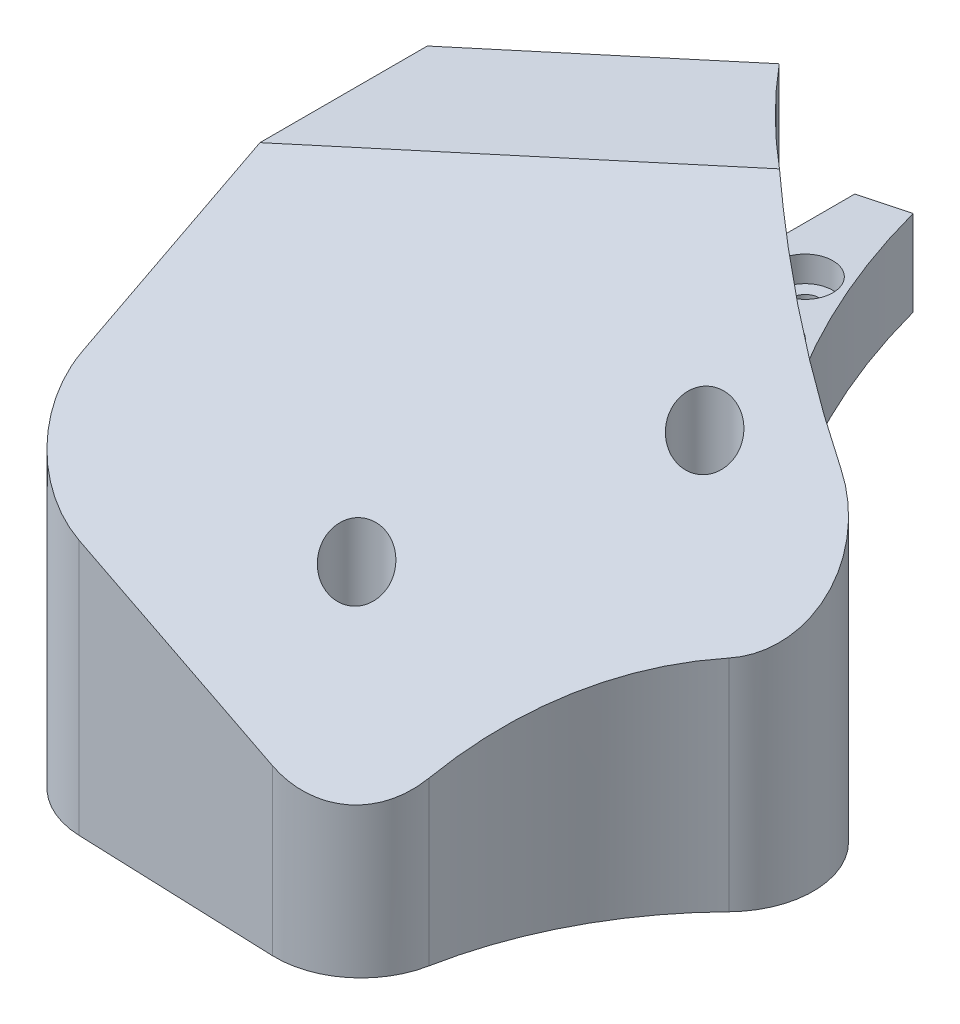
ISO-10303-21;
HEADER;
FILE_DESCRIPTION(('STEP AP214'),'2;1');
FILE_NAME('part.step','',(''),(''),'','','');
FILE_SCHEMA(('AUTOMOTIVE_DESIGN { 1 0 10303 214 1 1 1 1 }'));
ENDSEC;
DATA;
#1=APPLICATION_CONTEXT('core data for automotive mechanical design processes');
#2=APPLICATION_PROTOCOL_DEFINITION('international standard','automotive_design',2000,#1);
#3=PRODUCT_CONTEXT('',#1,'mechanical');
#4=PRODUCT('Part','Part','',(#3));
#5=PRODUCT_RELATED_PRODUCT_CATEGORY('part','',(#4));
#6=PRODUCT_DEFINITION_FORMATION('','',#4);
#7=PRODUCT_DEFINITION_CONTEXT('part definition',#1,'design');
#8=PRODUCT_DEFINITION('design','',#6,#7);
#9=PRODUCT_DEFINITION_SHAPE('','',#8);
#10=(LENGTH_UNIT() NAMED_UNIT(*) SI_UNIT(.MILLI.,.METRE.));
#11=(NAMED_UNIT(*) PLANE_ANGLE_UNIT() SI_UNIT($,.RADIAN.));
#12=(NAMED_UNIT(*) SI_UNIT($,.STERADIAN.) SOLID_ANGLE_UNIT());
#13=UNCERTAINTY_MEASURE_WITH_UNIT(LENGTH_MEASURE(1.E-05),#10,'distance_accuracy_value','');
#14=(GEOMETRIC_REPRESENTATION_CONTEXT(3) GLOBAL_UNCERTAINTY_ASSIGNED_CONTEXT((#13)) GLOBAL_UNIT_ASSIGNED_CONTEXT((#10,
#11,#12)) REPRESENTATION_CONTEXT('',''));
#15=CARTESIAN_POINT('',(0.,0.,0.));
#16=DIRECTION('',(0.,0.,1.));
#17=DIRECTION('',(1.,0.,0.));
#18=AXIS2_PLACEMENT_3D('',#15,#16,#17);
#19=CARTESIAN_POINT('',(690.079824827852,956.573514477968,1340.32447197574));
#20=DIRECTION('',(0.,-1.,0.));
#21=DIRECTION('',(0.,0.,-1.));
#22=AXIS2_PLACEMENT_3D('',#19,#20,#21);
#23=CYLINDRICAL_SURFACE('',#22,84.9999999999999);
#24=CARTESIAN_POINT('',(690.079824827852,1006.70276116639,1340.32447197574));
#25=DIRECTION('',(-0.359725820843491,-0.828739857716825,-0.428704539339128));
#26=DIRECTION('',(0.532703712193763,-0.559634030623136,0.634851562795184));
#27=AXIS2_PLACEMENT_3D('',#24,#25,#26);
#28=ELLIPSE('',#27,102.565357763985,84.9999999999999);
#29=CARTESIAN_POINT('',(654.936479666339,981.921153127971,1417.71920881785));
#30=VERTEX_POINT('',#29);
#31=CARTESIAN_POINT('',(635.629762562526,996.573514477968,1405.59460848013));
#32=VERTEX_POINT('',#31);
#33=EDGE_CURVE('E149',#30,#32,#28,.T.);
#34=ORIENTED_EDGE('',*,*,#33,.F.);
#35=DIRECTION('',(0.,-1.,0.));
#36=VECTOR('',#35,1.);
#37=CARTESIAN_POINT('',(654.936479666339,956.573514477968,1417.71920881785));
#38=LINE('',#37,#36);
#39=CARTESIAN_POINT('',(654.936479666339,946.573514477968,1417.71920881785));
#40=VERTEX_POINT('',#39);
#41=EDGE_CURVE('E11',#30,#40,#38,.T.);
#42=ORIENTED_EDGE('',*,*,#41,.T.);
#43=CARTESIAN_POINT('',(690.079824827852,946.573514477968,1340.32447197574));
#44=DIRECTION('',(0.,1.,0.));
#45=DIRECTION('',(0.,0.,1.));
#46=AXIS2_PLACEMENT_3D('',#43,#44,#45);
#47=CIRCLE('',#46,84.9999999999999);
#48=CARTESIAN_POINT('',(607.970423031093,946.573514477968,1362.30278257001));
#49=VERTEX_POINT('',#48);
#50=EDGE_CURVE('E183',#49,#40,#47,.T.);
#51=ORIENTED_EDGE('',*,*,#50,.F.);
#52=DIRECTION('',(0.,-1.,0.));
#53=VECTOR('',#52,1.);
#54=CARTESIAN_POINT('',(607.970423031093,956.573514477968,1362.30278257001));
#55=LINE('',#54,#53);
#56=CARTESIAN_POINT('',(607.970423031093,956.573514477968,1362.30278257001));
#57=VERTEX_POINT('',#56);
#58=EDGE_CURVE('E161',#57,#49,#55,.T.);
#59=ORIENTED_EDGE('',*,*,#58,.F.);
#60=CARTESIAN_POINT('',(690.079824827852,956.573514477968,1340.32447197574));
#61=DIRECTION('',(0.,1.,0.));
#62=DIRECTION('',(0.,0.,1.));
#63=AXIS2_PLACEMENT_3D('',#60,#61,#62);
#64=CIRCLE('',#63,84.9999999999999);
#65=CARTESIAN_POINT('',(624.966047162739,956.573514477968,1394.9614187991));
#66=VERTEX_POINT('',#65);
#67=EDGE_CURVE('E184',#57,#66,#64,.T.);
#68=ORIENTED_EDGE('',*,*,#67,.T.);
#69=DIRECTION('',(0.,-1.,0.));
#70=VECTOR('',#69,1.);
#71=CARTESIAN_POINT('',(624.966047162739,996.573514477968,1394.9614187991));
#72=LINE('',#71,#70);
#73=CARTESIAN_POINT('',(624.966047162739,996.573514477968,1394.9614187991));
#74=VERTEX_POINT('',#73);
#75=EDGE_CURVE('E172',#74,#66,#72,.T.);
#76=ORIENTED_EDGE('',*,*,#75,.F.);
#77=CARTESIAN_POINT('',(690.079824827852,996.573514477968,1340.32447197574));
#78=DIRECTION('',(0.,1.,0.));
#79=DIRECTION('',(0.,0.,1.));
#80=AXIS2_PLACEMENT_3D('',#77,#78,#79);
#81=CIRCLE('',#80,84.9999999999999);
#82=EDGE_CURVE('E168',#74,#32,#81,.T.);
#83=ORIENTED_EDGE('',*,*,#82,.T.);
#84=EDGE_LOOP('',(#34,#42,#51,#59,#68,#76,#83));
#85=FACE_BOUND('',#84,.T.);
#86=ADVANCED_FACE('F49',(#85),#23,.F.);
#87=CARTESIAN_POINT('',(380.916913119868,956.573514477968,1423.07843618761));
#88=DIRECTION('',(-0.2585683599326,0.,-0.965992962314822));
#89=DIRECTION('',(-0.965992962314822,0.,0.2585683599326));
#90=AXIS2_PLACEMENT_3D('',#87,#88,#89);
#91=PLANE('',#90);
#92=DIRECTION('',(0.965992962314822,0.,-0.2585683599326));
#93=VECTOR('',#92,1.);
#94=CARTESIAN_POINT('',(380.916913119868,946.573514477968,1423.07843618761));
#95=LINE('',#94,#93);
#96=CARTESIAN_POINT('',(602.579824827852,946.573514477968,1363.74568970375));
#97=VERTEX_POINT('',#96);
#98=EDGE_CURVE('E201',#97,#49,#95,.T.);
#99=ORIENTED_EDGE('',*,*,#98,.F.);
#100=DIRECTION('',(0.,-1.,0.));
#101=VECTOR('',#100,1.);
#102=CARTESIAN_POINT('',(602.579824827852,956.573514477968,1363.74568970375));
#103=LINE('',#102,#101);
#104=CARTESIAN_POINT('',(602.579824827852,956.573514477968,1363.74568970375));
#105=VERTEX_POINT('',#104);
#106=EDGE_CURVE('E197',#105,#97,#103,.T.);
#107=ORIENTED_EDGE('',*,*,#106,.F.);
#108=DIRECTION('',(0.965992962314822,0.,-0.2585683599326));
#109=VECTOR('',#108,1.);
#110=CARTESIAN_POINT('',(380.916913119868,956.573514477968,1423.07843618761));
#111=LINE('',#110,#109);
#112=EDGE_CURVE('E188',#105,#57,#111,.T.);
#113=ORIENTED_EDGE('',*,*,#112,.T.);
#114=ORIENTED_EDGE('',*,*,#58,.T.);
#115=EDGE_LOOP('',(#99,#107,#113,#114));
#116=FACE_BOUND('',#115,.T.);
#117=ADVANCED_FACE('F289',(#116),#91,.T.);
#118=CARTESIAN_POINT('',(602.579824827852,956.573514477968,0.));
#119=DIRECTION('',(1.,0.,0.));
#120=DIRECTION('',(0.,0.,-1.));
#121=AXIS2_PLACEMENT_3D('',#118,#119,#120);
#122=PLANE('',#121);
#123=DIRECTION('',(0.,0.,1.));
#124=VECTOR('',#123,1.);
#125=CARTESIAN_POINT('',(602.579824827852,946.573514477968,0.));
#126=LINE('',#125,#124);
#127=CARTESIAN_POINT('',(602.579824827852,946.573514477968,1454.11027046215));
#128=VERTEX_POINT('',#127);
#129=EDGE_CURVE('E205',#97,#128,#126,.T.);
#130=ORIENTED_EDGE('',*,*,#129,.T.);
#131=DIRECTION('',(0.,-1.,0.));
#132=VECTOR('',#131,1.);
#133=CARTESIAN_POINT('',(602.579824827852,956.573514477968,1454.11027046215));
#134=LINE('',#133,#132);
#135=CARTESIAN_POINT('',(602.579824827852,985.822289642653,1454.11027046215));
#136=VERTEX_POINT('',#135);
#137=EDGE_CURVE('E146',#128,#136,#134,.F.);
#138=ORIENTED_EDGE('',*,*,#137,.T.);
#139=DIRECTION('',(0.,0.459461806354499,-0.888197527862728));
#140=VECTOR('',#139,1.);
#141=CARTESIAN_POINT('',(602.579824827852,1573.05971327824,318.9063846811));
#142=LINE('',#141,#140);
#143=CARTESIAN_POINT('',(602.579824827855,996.573514477965,1433.32679904373));
#144=VERTEX_POINT('',#143);
#145=EDGE_CURVE('E137',#136,#144,#142,.T.);
#146=ORIENTED_EDGE('',*,*,#145,.T.);
#147=DIRECTION('',(0.,0.,-1.));
#148=VECTOR('',#147,1.);
#149=CARTESIAN_POINT('',(602.579824827852,996.573514477968,0.));
#150=LINE('',#149,#148);
#151=CARTESIAN_POINT('',(602.579824827852,996.573514477968,1413.74568970375));
#152=VERTEX_POINT('',#151);
#153=EDGE_CURVE('E143',#144,#152,#150,.T.);
#154=ORIENTED_EDGE('',*,*,#153,.T.);
#155=DIRECTION('',(0.,-1.,0.));
#156=VECTOR('',#155,1.);
#157=CARTESIAN_POINT('',(602.579824827852,996.573514477968,1413.74568970375));
#158=LINE('',#157,#156);
#159=CARTESIAN_POINT('',(602.579824827852,976.573514477968,1413.74568970375));
#160=VERTEX_POINT('',#159);
#161=EDGE_CURVE('E180',#152,#160,#158,.T.);
#162=ORIENTED_EDGE('',*,*,#161,.T.);
#163=CARTESIAN_POINT('',(602.579824827852,976.573514477968,1413.74568970375));
#164=CARTESIAN_POINT('',(602.579824827852,976.289515428693,1413.74571179691));
#165=CARTESIAN_POINT('',(602.579824827852,976.005522314769,1413.73779442892));
#166=CARTESIAN_POINT('',(602.579824827852,975.438577532554,1413.70624392088));
#167=CARTESIAN_POINT('',(602.579824827852,975.155625348713,1413.68262005492));
#168=CARTESIAN_POINT('',(602.579824827852,974.591512420124,1413.61982576349));
#169=CARTESIAN_POINT('',(602.579824827852,974.310351321758,1413.58065850995));
#170=CARTESIAN_POINT('',(602.579824827852,973.752653973037,1413.48744137867));
#171=CARTESIAN_POINT('',(602.579824827852,973.476098891919,1413.43350388666));
#172=CARTESIAN_POINT('',(602.579824827852,972.926206932194,1413.31103926093));
#173=CARTESIAN_POINT('',(602.579824827852,972.652870423499,1413.24251046715));
#174=CARTESIAN_POINT('',(602.579824827852,972.11011936153,1413.09140979312));
#175=CARTESIAN_POINT('',(602.579824827853,971.840704926373,1413.00883749088));
#176=CARTESIAN_POINT('',(602.579824827853,971.155500686068,1412.77984278279));
#177=CARTESIAN_POINT('',(602.579824827852,970.742930310606,1412.62368888122));
#178=CARTESIAN_POINT('',(602.579824827852,969.930593149715,1412.28123406434));
#179=CARTESIAN_POINT('',(602.579824827852,969.530826490668,1412.09493285156));
#180=CARTESIAN_POINT('',(602.579824827852,968.744492331954,1411.69468225352));
#181=CARTESIAN_POINT('',(602.579824827852,968.357950659255,1411.4806822827));
#182=CARTESIAN_POINT('',(602.579824827852,967.599521528065,1411.02812049283));
#183=CARTESIAN_POINT('',(602.579824827853,967.227635853127,1410.78955569706));
#184=CARTESIAN_POINT('',(602.579824827853,966.473969404969,1410.27342401854));
#185=CARTESIAN_POINT('',(602.579824827852,966.09325350775,1409.99430525192));
#186=CARTESIAN_POINT('',(602.579824827852,965.349024083418,1409.41374222933));
#187=CARTESIAN_POINT('',(602.579824827852,964.985518417297,1409.11228792953));
#188=CARTESIAN_POINT('',(602.579824827852,964.275877277716,1408.48945724288));
#189=CARTESIAN_POINT('',(602.579824827852,963.929746024082,1408.16807605823));
#190=CARTESIAN_POINT('',(602.579824827852,963.253625245954,1407.50596564602));
#191=CARTESIAN_POINT('',(602.579824827852,962.923711226857,1407.16515942806));
#192=CARTESIAN_POINT('',(602.579824827852,962.282001587325,1406.46707942557));
#193=CARTESIAN_POINT('',(602.579824827852,961.970201181128,1406.10981003588));
#194=CARTESIAN_POINT('',(602.579824827852,961.365224244622,1405.37990492482));
#195=CARTESIAN_POINT('',(602.579824827853,961.07204534206,1405.00727117078));
#196=CARTESIAN_POINT('',(602.579824827853,960.54598123893,1404.3020524516));
#197=CARTESIAN_POINT('',(602.579824827852,960.310487075852,1403.97141057223));
#198=CARTESIAN_POINT('',(602.579824827852,959.854716444258,1403.29980085351));
#199=CARTESIAN_POINT('',(602.579824827852,959.634439361921,1402.95883343147));
#200=CARTESIAN_POINT('',(602.579824827852,959.210258623836,1402.26673719028));
#201=CARTESIAN_POINT('',(602.579824827852,959.006358694227,1401.91560608326));
#202=CARTESIAN_POINT('',(602.579824827852,958.618233650723,1401.20639699001));
#203=CARTESIAN_POINT('',(602.579824827852,958.433858884878,1400.84840116447));
#204=CARTESIAN_POINT('',(602.579824827852,958.084982265139,1400.12289480108));
#205=CARTESIAN_POINT('',(602.579824827852,957.920477171991,1399.755385826));
#206=CARTESIAN_POINT('',(602.579824827852,957.614039440689,1399.01108810839));
#207=CARTESIAN_POINT('',(602.579824827852,957.47210105254,1398.63430175807));
#208=CARTESIAN_POINT('',(602.579824827852,957.265860978823,1398.02439430153));
#209=CARTESIAN_POINT('',(602.579824827852,957.193211558572,1397.79407887338));
#210=CARTESIAN_POINT('',(602.579824827852,957.058251735251,1397.33051229819));
#211=CARTESIAN_POINT('',(602.579824827852,956.995937397506,1397.09726230492));
#212=CARTESIAN_POINT('',(602.579824827852,956.882711073926,1396.62816744011));
#213=CARTESIAN_POINT('',(602.579824827852,956.831791185101,1396.39232448685));
#214=CARTESIAN_POINT('',(602.579824827852,956.742029425449,1395.91575179165));
#215=CARTESIAN_POINT('',(602.579824827852,956.703320819644,1395.67499674522));
#216=CARTESIAN_POINT('',(602.579824827852,956.640084562322,1395.19141126955));
#217=CARTESIAN_POINT('',(602.579824827852,956.615567360775,1394.94857944423));
#218=CARTESIAN_POINT('',(602.579824827852,956.582268930391,1394.46117698115));
#219=CARTESIAN_POINT('',(602.579824827852,956.573531647421,1394.21660338593));
#220=CARTESIAN_POINT('',(602.579824827853,956.573514477968,1393.97191844502));
#221=B_SPLINE_CURVE_WITH_KNOTS('',3,(#163,#164,#165,#166,#167,#168,#169,#170,#171,#172,#173,
#174,#175,#176,#177,#178,#179,#180,#181,#182,#183,#184,#185,#186,#187,#188,#189,#190,#191,#192,
#193,#194,#195,#196,#197,#198,#199,#200,#201,#202,#203,#204,#205,#206,#207,#208,#209,#210,#211,
#212,#213,#214,#215,#216,#217,#218,#219,#220),.UNSPECIFIED.,.F.,.F.,(4,2,2,2,2,2,2,2,2,2,2,2,2,
2,2,2,2,2,2,2,2,2,2,2,2,2,2,2,4),(0.,0.851877245652734,1.70325193754368,2.55445297999069,
3.39934910643316,4.24434140786865,5.08935910456493,6.41137137606057,7.73339669272274,
9.05787138770494,10.3825067693148,11.7978057369135,13.2137450438719,14.6300266006197,
16.0523756410847,17.4743471601533,18.8961371648526,20.1135454498361,21.3309045986387,
22.5485399416664,23.7560391794174,24.9633412981061,26.1703353016179,26.8946391440828,
27.6186666002245,28.3421903162506,29.0733568020184,29.8050610061224,30.5387998265013),.UNSPECIFIED.);
#222=CARTESIAN_POINT('',(602.579824827852,956.573514477968,1393.97191844502));
#223=VERTEX_POINT('',#222);
#224=EDGE_CURVE('E244',#160,#223,#221,.T.);
#225=ORIENTED_EDGE('',*,*,#224,.T.);
#226=DIRECTION('',(0.,0.,1.));
#227=VECTOR('',#226,1.);
#228=CARTESIAN_POINT('',(602.579824827852,956.573514477968,0.));
#229=LINE('',#228,#227);
#230=EDGE_CURVE('E193',#105,#223,#229,.T.);
#231=ORIENTED_EDGE('',*,*,#230,.F.);
#232=ORIENTED_EDGE('',*,*,#106,.T.);
#233=EDGE_LOOP('',(#130,#138,#146,#154,#162,#225,#231,#232));
#234=FACE_BOUND('',#233,.T.);
#235=ADVANCED_FACE('F140',(#234),#122,.F.);
#236=CARTESIAN_POINT('',(-53.4696364467969,956.573514477968,1439.37488360944));
#237=DIRECTION('',(0.0371222134026683,0.,-0.999310733091608));
#238=DIRECTION('',(-0.999310733091608,0.,-0.0371222134026683));
#239=AXIS2_PLACEMENT_3D('',#236,#237,#238);
#240=PLANE('',#239);
#241=DIRECTION('',(-0.910279268030285,0.412611448574302,-0.0338148887276558));
#242=VECTOR('',#241,1.);
#243=CARTESIAN_POINT('',(67.3351154184647,1223.45367568539,1443.86251656513));
#244=LINE('',#243,#242);
#245=CARTESIAN_POINT('',(635.689675773142,965.829881880661,1464.97564842612));
#246=VERTEX_POINT('',#245);
#247=CARTESIAN_POINT('',(612.208602693826,976.47338428438,1464.10337779306));
#248=VERTEX_POINT('',#247);
#249=EDGE_CURVE('E150',#246,#248,#244,.T.);
#250=ORIENTED_EDGE('',*,*,#249,.T.);
#251=DIRECTION('',(0.,-1.,0.));
#252=VECTOR('',#251,1.);
#253=CARTESIAN_POINT('',(612.208602693826,956.573514477968,1464.10337779306));
#254=LINE('',#253,#252);
#255=CARTESIAN_POINT('',(612.208602693826,946.573514477968,1464.10337779306));
#256=VERTEX_POINT('',#255);
#257=EDGE_CURVE('E305',#248,#256,#254,.T.);
#258=ORIENTED_EDGE('',*,*,#257,.T.);
#259=DIRECTION('',(0.999310733091608,0.,0.0371222134026683));
#260=VECTOR('',#259,1.);
#261=CARTESIAN_POINT('',(-53.4696364467969,946.573514477968,1439.37488360944));
#262=LINE('',#261,#260);
#263=CARTESIAN_POINT('',(635.689675773142,946.573514477968,1464.97564842612));
#264=VERTEX_POINT('',#263);
#265=EDGE_CURVE('E208',#256,#264,#262,.T.);
#266=ORIENTED_EDGE('',*,*,#265,.T.);
#267=DIRECTION('',(0.,1.,0.));
#268=VECTOR('',#267,1.);
#269=CARTESIAN_POINT('',(635.689675773142,961.573514477965,1464.97564842612));
#270=LINE('',#269,#268);
#271=EDGE_CURVE('E256',#264,#246,#270,.T.);
#272=ORIENTED_EDGE('',*,*,#271,.T.);
#273=EDGE_LOOP('',(#250,#258,#266,#272));
#274=FACE_BOUND('',#273,.T.);
#275=ADVANCED_FACE('F335',(#274),#240,.F.);
#276=CARTESIAN_POINT('',(690.079824827852,956.573514477968,1465.32447197574));
#277=DIRECTION('',(0.,-1.,0.));
#278=DIRECTION('',(0.,0.,-1.));
#279=AXIS2_PLACEMENT_3D('',#276,#277,#278);
#280=CYLINDRICAL_SURFACE('',#279,45.);
#281=CARTESIAN_POINT('',(690.079824827852,942.040651677625,1465.32447197574));
#282=DIRECTION('',(-0.359725820843491,-0.828739857716825,-0.428704539339128));
#283=DIRECTION('',(0.532703712193763,-0.559634030623136,0.634851562795184));
#284=AXIS2_PLACEMENT_3D('',#281,#282,#283);
#285=ELLIPSE('',#284,54.2993070515213,45.);
#286=CARTESIAN_POINT('',(645.882520983656,965.602242082271,1456.86289216439));
#287=VERTEX_POINT('',#286);
#288=CARTESIAN_POINT('',(657.94339689941,972.284757438113,1433.82447197574));
#289=VERTEX_POINT('',#288);
#290=EDGE_CURVE('E329',#287,#289,#285,.T.);
#291=ORIENTED_EDGE('',*,*,#290,.F.);
#292=DIRECTION('',(0.,-1.,0.));
#293=VECTOR('',#292,1.);
#294=CARTESIAN_POINT('',(645.882520983656,956.573514477968,1456.86289216439));
#295=LINE('',#294,#293);
#296=CARTESIAN_POINT('',(645.882520983656,946.573514477968,1456.86289216439));
#297=VERTEX_POINT('',#296);
#298=EDGE_CURVE('E58',#287,#297,#295,.T.);
#299=ORIENTED_EDGE('',*,*,#298,.T.);
#300=CARTESIAN_POINT('',(690.079824827852,946.573514477968,1465.32447197574));
#301=DIRECTION('',(0.,1.,0.));
#302=DIRECTION('',(0.,0.,1.));
#303=AXIS2_PLACEMENT_3D('',#300,#301,#302);
#304=CIRCLE('',#303,45.);
#305=CARTESIAN_POINT('',(657.94339689941,946.573514477968,1433.82447197574));
#306=VERTEX_POINT('',#305);
#307=EDGE_CURVE('E189',#306,#297,#304,.T.);
#308=ORIENTED_EDGE('',*,*,#307,.F.);
#309=DIRECTION('',(0.,-1.,0.));
#310=VECTOR('',#309,1.);
#311=CARTESIAN_POINT('',(657.94339689941,956.573514477968,1433.82447197574));
#312=LINE('',#311,#310);
#313=EDGE_CURVE('E65',#306,#289,#312,.F.);
#314=ORIENTED_EDGE('',*,*,#313,.T.);
#315=EDGE_LOOP('',(#291,#299,#308,#314));
#316=FACE_BOUND('',#315,.T.);
#317=ADVANCED_FACE('F328',(#316),#280,.F.);
#318=CARTESIAN_POINT('',(0.,956.573514477968,0.));
#319=DIRECTION('',(0.,1.,0.));
#320=DIRECTION('',(0.,0.,1.));
#321=AXIS2_PLACEMENT_3D('',#318,#319,#320);
#322=PLANE('',#321);
#323=CARTESIAN_POINT('',(608.055357669983,956.573514477968,1375.02556224488));
#324=DIRECTION('',(0.,1.,0.));
#325=DIRECTION('',(0.,0.,1.));
#326=AXIS2_PLACEMENT_3D('',#323,#324,#325);
#327=CIRCLE('',#326,3.24999999999998);
#328=CARTESIAN_POINT('',(608.055357669983,956.573514477968,1378.27556224488));
#329=VERTEX_POINT('',#328);
#330=EDGE_CURVE('E223',#329,#329,#327,.T.);
#331=ORIENTED_EDGE('',*,*,#330,.F.);
#332=EDGE_LOOP('',(#331));
#333=FACE_BOUND('',#332,.T.);
#334=CARTESIAN_POINT('',(612.096087864369,956.573514477968,1383.6233817066));
#335=DIRECTION('',(0.,1.,0.));
#336=DIRECTION('',(0.,0.,1.));
#337=AXIS2_PLACEMENT_3D('',#334,#335,#336);
#338=CIRCLE('',#337,3.24999999999998);
#339=CARTESIAN_POINT('',(612.096087864369,956.573514477968,1386.8733817066));
#340=VERTEX_POINT('',#339);
#341=EDGE_CURVE('E625',#340,#340,#338,.T.);
#342=ORIENTED_EDGE('',*,*,#341,.F.);
#343=EDGE_LOOP('',(#342));
#344=FACE_BOUND('',#343,.T.);
#345=ORIENTED_EDGE('',*,*,#230,.T.);
#346=CARTESIAN_POINT('',(624.966047162739,956.573514477968,1394.9614187991));
#347=CARTESIAN_POINT('',(611.076096954244,956.573514477967,1393.56239800279));
#348=CARTESIAN_POINT('',(597.18614674575,956.573514477968,1392.16337720649));
#349=CARTESIAN_POINT('',(589.724072634122,956.573514477968,1398.42480084137));
#350=CARTESIAN_POINT('',(588.977865222959,956.573514477968,1399.05094320486));
#351=CARTESIAN_POINT('',(588.231657811796,956.573514477968,1399.67708556835));
#352=CARTESIAN_POINT('',(587.485450400633,956.573514477968,1400.30322793184));
#353=CARTESIAN_POINT('',(573.307509588538,956.573514477966,1412.19993283812));
#354=CARTESIAN_POINT('',(559.129568776444,956.573514477965,1424.0966377444));
#355=CARTESIAN_POINT('',(544.951627964349,956.573514477964,1435.99334265068));
#356=(BOUNDED_CURVE() B_SPLINE_CURVE(3,(#346,#347,#348,#349,#350,#351,#352,#353,#354,#355),
.UNSPECIFIED.,.F.,.F.) B_SPLINE_CURVE_WITH_KNOTS((4,3,3,4),(0.,0.909090909090899,1.,
2.72727272727274),
.UNSPECIFIED.) CURVE() GEOMETRIC_REPRESENTATION_ITEM() RATIONAL_B_SPLINE_CURVE((1.,1.,1.,1.,1.,
1.,1.,1.,1.,1.)) REPRESENTATION_ITEM(''));
#357=EDGE_CURVE('E236',#223,#66,#356,.F.);
#358=ORIENTED_EDGE('',*,*,#357,.T.);
#359=ORIENTED_EDGE('',*,*,#67,.F.);
#360=ORIENTED_EDGE('',*,*,#112,.F.);
#361=EDGE_LOOP('',(#345,#358,#359,#360));
#362=FACE_BOUND('',#361,.T.);
#363=ADVANCED_FACE('F344',(#333,#344,#362),#322,.T.);
#364=CARTESIAN_POINT('',(0.,946.573514477968,0.));
#365=DIRECTION('',(0.,1.,0.));
#366=DIRECTION('',(0.,0.,1.));
#367=AXIS2_PLACEMENT_3D('',#364,#365,#366);
#368=PLANE('',#367);
#369=CARTESIAN_POINT('',(630.243715549145,946.573514477968,1449.68349929542));
#370=DIRECTION('',(0.,1.,0.));
#371=DIRECTION('',(0.,0.,1.));
#372=AXIS2_PLACEMENT_3D('',#369,#370,#371);
#373=CIRCLE('',#372,1.70000000000003);
#374=CARTESIAN_POINT('',(630.243715549145,946.573514477968,1451.38349929542));
#375=VERTEX_POINT('',#374);
#376=EDGE_CURVE('E230',#375,#375,#373,.T.);
#377=ORIENTED_EDGE('',*,*,#376,.T.);
#378=EDGE_LOOP('',(#377));
#379=FACE_BOUND('',#378,.T.);
#380=CARTESIAN_POINT('',(644.643715549145,946.573514477968,1423.36544465606));
#381=DIRECTION('',(0.,1.,0.));
#382=DIRECTION('',(0.,0.,1.));
#383=AXIS2_PLACEMENT_3D('',#380,#381,#382);
#384=CIRCLE('',#383,1.70000000000003);
#385=CARTESIAN_POINT('',(644.643715549145,946.573514477968,1425.06544465606));
#386=VERTEX_POINT('',#385);
#387=EDGE_CURVE('E224',#386,#386,#384,.T.);
#388=ORIENTED_EDGE('',*,*,#387,.T.);
#389=EDGE_LOOP('',(#388));
#390=FACE_BOUND('',#389,.T.);
#391=CARTESIAN_POINT('',(608.055357669983,946.573514477968,1375.02556224488));
#392=DIRECTION('',(0.,1.,0.));
#393=DIRECTION('',(0.,0.,1.));
#394=AXIS2_PLACEMENT_3D('',#391,#392,#393);
#395=CIRCLE('',#394,1.70000000000003);
#396=CARTESIAN_POINT('',(608.055357669983,946.573514477968,1376.72556224488));
#397=VERTEX_POINT('',#396);
#398=EDGE_CURVE('E621',#397,#397,#395,.T.);
#399=ORIENTED_EDGE('',*,*,#398,.T.);
#400=EDGE_LOOP('',(#399));
#401=FACE_BOUND('',#400,.T.);
#402=CARTESIAN_POINT('',(612.096087864369,946.573514477968,1383.6233817066));
#403=DIRECTION('',(0.,1.,0.));
#404=DIRECTION('',(0.,0.,1.));
#405=AXIS2_PLACEMENT_3D('',#402,#403,#404);
#406=CIRCLE('',#405,1.70000000000003);
#407=CARTESIAN_POINT('',(612.096087864369,946.573514477968,1385.3233817066));
#408=VERTEX_POINT('',#407);
#409=EDGE_CURVE('E637',#408,#408,#406,.T.);
#410=ORIENTED_EDGE('',*,*,#409,.T.);
#411=EDGE_LOOP('',(#410));
#412=FACE_BOUND('',#411,.T.);
#413=ORIENTED_EDGE('',*,*,#265,.F.);
#414=CARTESIAN_POINT('',(612.579824827852,946.573514477968,1454.11027046215));
#415=DIRECTION('',(0.,1.,0.));
#416=DIRECTION('',(0.,0.,1.));
#417=AXIS2_PLACEMENT_3D('',#414,#415,#416);
#418=CIRCLE('',#417,10.);
#419=EDGE_CURVE('E309',#256,#128,#418,.F.);
#420=ORIENTED_EDGE('',*,*,#419,.T.);
#421=ORIENTED_EDGE('',*,*,#129,.F.);
#422=ORIENTED_EDGE('',*,*,#98,.T.);
#423=ORIENTED_EDGE('',*,*,#50,.T.);
#424=CARTESIAN_POINT('',(650.801968470867,946.573514477968,1426.82447197574));
#425=DIRECTION('',(0.,1.,0.));
#426=DIRECTION('',(0.,0.,1.));
#427=AXIS2_PLACEMENT_3D('',#424,#425,#426);
#428=CIRCLE('',#427,10.);
#429=EDGE_CURVE('E301',#40,#306,#428,.F.);
#430=ORIENTED_EDGE('',*,*,#429,.T.);
#431=ORIENTED_EDGE('',*,*,#307,.T.);
#432=CARTESIAN_POINT('',(636.060897907169,946.573514477968,1454.9825410952));
#433=DIRECTION('',(0.,1.,0.));
#434=DIRECTION('',(0.,0.,1.));
#435=AXIS2_PLACEMENT_3D('',#432,#433,#434);
#436=CIRCLE('',#435,10.);
#437=EDGE_CURVE('E304',#297,#264,#436,.F.);
#438=ORIENTED_EDGE('',*,*,#437,.T.);
#439=EDGE_LOOP('',(#413,#420,#421,#422,#423,#430,#431,#438));
#440=FACE_BOUND('',#439,.T.);
#441=ADVANCED_FACE('F331',(#379,#390,#401,#412,#440),#368,.F.);
#442=CARTESIAN_POINT('',(945.105326177741,996.573514477968,1126.33266785225));
#443=DIRECTION('',(0.642787609686538,0.,0.766044443118979));
#444=DIRECTION('',(0.766044443118979,0.,-0.642787609686538));
#445=AXIS2_PLACEMENT_3D('',#442,#443,#444);
#446=PLANE('',#445);
#447=ORIENTED_EDGE('',*,*,#75,.T.);
#448=CARTESIAN_POINT('',(624.966047162739,956.573514477968,1394.9614187991));
#449=CARTESIAN_POINT('',(617.50397305111,966.573514477967,1401.22284243398));
#450=CARTESIAN_POINT('',(610.041898939481,976.573514477968,1407.48426606887));
#451=CARTESIAN_POINT('',(602.579824827852,976.573514477968,1413.74568970375));
#452=CARTESIAN_POINT('',(601.83361741669,976.573514477968,1414.37183206724));
#453=CARTESIAN_POINT('',(601.087410005527,976.573514477968,1414.99797443073));
#454=CARTESIAN_POINT('',(600.341202594363,976.573514477968,1415.62411679422));
#455=CARTESIAN_POINT('',(586.163261782269,976.573514477966,1427.5208217005));
#456=CARTESIAN_POINT('',(571.985320970174,976.573514477965,1439.41752660678));
#457=CARTESIAN_POINT('',(557.80738015808,976.573514477964,1451.31423151306));
#458=(BOUNDED_CURVE() B_SPLINE_CURVE(3,(#448,#449,#450,#451,#452,#453,#454,#455,#456,#457),
.UNSPECIFIED.,.F.,.F.) B_SPLINE_CURVE_WITH_KNOTS((4,3,3,4),(0.,0.909090909090899,1.,
2.72727272727274),
.UNSPECIFIED.) CURVE() GEOMETRIC_REPRESENTATION_ITEM() RATIONAL_B_SPLINE_CURVE((1.,1.,1.,1.,1.,
1.,1.,1.,1.,1.)) REPRESENTATION_ITEM(''));
#459=EDGE_CURVE('E160',#66,#160,#458,.T.);
#460=ORIENTED_EDGE('',*,*,#459,.T.);
#461=ORIENTED_EDGE('',*,*,#161,.F.);
#462=DIRECTION('',(-0.766044443118979,0.,0.642787609686538));
#463=VECTOR('',#462,1.);
#464=CARTESIAN_POINT('',(945.105326177741,996.573514477968,1126.33266785225));
#465=LINE('',#464,#463);
#466=EDGE_CURVE('E165',#74,#152,#465,.T.);
#467=ORIENTED_EDGE('',*,*,#466,.F.);
#468=EDGE_LOOP('',(#447,#460,#461,#467));
#469=FACE_BOUND('',#468,.T.);
#470=ADVANCED_FACE('F348',(#469),#446,.F.);
#471=CARTESIAN_POINT('',(690.079824827852,996.573514477968,1465.32447197574));
#472=DIRECTION('',(0.,1.,0.));
#473=DIRECTION('',(0.,0.,1.));
#474=AXIS2_PLACEMENT_3D('',#471,#472,#473);
#475=PLANE('',#474);
#476=DIRECTION('',(-0.766044443118976,0.,0.642787609686542));
#477=VECTOR('',#476,1.);
#478=CARTESIAN_POINT('',(638.171154409884,996.573514477968,1403.46212751834));
#479=LINE('',#478,#477);
#480=EDGE_CURVE('E153',#32,#144,#479,.T.);
#481=ORIENTED_EDGE('',*,*,#480,.F.);
#482=ORIENTED_EDGE('',*,*,#82,.F.);
#483=ORIENTED_EDGE('',*,*,#466,.T.);
#484=ORIENTED_EDGE('',*,*,#153,.F.);
#485=EDGE_LOOP('',(#481,#482,#483,#484));
#486=FACE_BOUND('',#485,.T.);
#487=ADVANCED_FACE('F163',(#486),#475,.T.);
#488=CARTESIAN_POINT('',(678.973429502402,996.573514477965,1369.22495353702));
#489=DIRECTION('',(-0.359725820843491,-0.828739857716825,-0.428704539339128));
#490=DIRECTION('',(0.,0.459461806354499,-0.888197527862728));
#491=AXIS2_PLACEMENT_3D('',#488,#489,#490);
#492=PLANE('',#491);
#493=CARTESIAN_POINT('',(630.243715549145,976.104356049068,1449.68349929542));
#494=DIRECTION('',(-0.359725820843491,-0.828739857716825,-0.428704539339128));
#495=DIRECTION('',(-0.532703712193763,0.559634030623136,-0.634851562795184));
#496=AXIS2_PLACEMENT_3D('',#493,#494,#495);
#497=ELLIPSE('',#496,3.92161662038763,3.24999999999998);
#498=CARTESIAN_POINT('',(628.154655817664,978.299026164894,1447.19385485528));
#499=VERTEX_POINT('',#498);
#500=EDGE_CURVE('E225',#499,#499,#497,.T.);
#501=ORIENTED_EDGE('',*,*,#500,.T.);
#502=EDGE_LOOP('',(#501));
#503=FACE_BOUND('',#502,.T.);
#504=CARTESIAN_POINT('',(644.643715549145,983.468087397929,1423.36544465606));
#505=DIRECTION('',(-0.359725820843491,-0.828739857716825,-0.428704539339128));
#506=DIRECTION('',(-0.532703712193763,0.559634030623136,-0.634851562795184));
#507=AXIS2_PLACEMENT_3D('',#504,#505,#506);
#508=ELLIPSE('',#507,3.92161662038763,3.24999999999998);
#509=CARTESIAN_POINT('',(642.554655817664,985.662757513755,1420.87580021593));
#510=VERTEX_POINT('',#509);
#511=EDGE_CURVE('E219',#510,#510,#508,.T.);
#512=ORIENTED_EDGE('',*,*,#511,.T.);
#513=EDGE_LOOP('',(#512));
#514=FACE_BOUND('',#513,.T.);
#515=ORIENTED_EDGE('',*,*,#145,.F.);
#516=CARTESIAN_POINT('',(612.579824827852,981.4816534648,1454.11027046215));
#517=DIRECTION('',(-0.359725820843491,-0.828739857716825,-0.428704539339128));
#518=DIRECTION('',(0.532703712193763,-0.559634030623136,0.634851562795184));
#519=AXIS2_PLACEMENT_3D('',#516,#517,#518);
#520=ELLIPSE('',#519,12.0665126781159,10.);
#521=EDGE_CURVE('E321',#136,#248,#520,.F.);
#522=ORIENTED_EDGE('',*,*,#521,.T.);
#523=ORIENTED_EDGE('',*,*,#249,.F.);
#524=CARTESIAN_POINT('',(636.060897907169,970.838151061081,1454.9825410952));
#525=DIRECTION('',(-0.359725820843491,-0.828739857716825,-0.428704539339128));
#526=DIRECTION('',(0.532703712193763,-0.559634030623136,0.634851562795184));
#527=AXIS2_PLACEMENT_3D('',#524,#525,#526);
#528=ELLIPSE('',#527,12.0665126781159,10.);
#529=EDGE_CURVE('E72',#246,#287,#528,.F.);
#530=ORIENTED_EDGE('',*,*,#529,.T.);
#531=ORIENTED_EDGE('',*,*,#290,.T.);
#532=CARTESIAN_POINT('',(650.801968470867,979.005669829333,1426.82447197574));
#533=DIRECTION('',(-0.359725820843491,-0.828739857716825,-0.428704539339128));
#534=DIRECTION('',(0.532703712193763,-0.559634030623136,0.634851562795184));
#535=AXIS2_PLACEMENT_3D('',#532,#533,#534);
#536=ELLIPSE('',#535,12.0665126781159,10.);
#537=EDGE_CURVE('E300',#289,#30,#536,.F.);
#538=ORIENTED_EDGE('',*,*,#537,.T.);
#539=ORIENTED_EDGE('',*,*,#33,.T.);
#540=ORIENTED_EDGE('',*,*,#480,.T.);
#541=EDGE_LOOP('',(#515,#522,#523,#530,#531,#538,#539,#540));
#542=FACE_BOUND('',#541,.T.);
#543=ADVANCED_FACE('F154',(#503,#514,#542),#492,.F.);
#544=CARTESIAN_POINT('',(612.096087864369,956.573514477968,1383.6233817066));
#545=DIRECTION('',(0.,1.,0.));
#546=DIRECTION('',(0.,0.,1.));
#547=AXIS2_PLACEMENT_3D('',#544,#545,#546);
#548=CYLINDRICAL_SURFACE('',#547,1.70000000000003);
#549=ORIENTED_EDGE('',*,*,#409,.F.);
#550=EDGE_LOOP('',(#549));
#551=FACE_BOUND('',#550,.T.);
#552=CARTESIAN_POINT('',(612.096087864369,953.573514477968,1383.6233817066));
#553=DIRECTION('',(0.,1.,0.));
#554=DIRECTION('',(0.,0.,1.));
#555=AXIS2_PLACEMENT_3D('',#552,#553,#554);
#556=CIRCLE('',#555,1.70000000000003);
#557=CARTESIAN_POINT('',(612.096087864369,953.573514477968,1385.3233817066));
#558=VERTEX_POINT('',#557);
#559=EDGE_CURVE('E633',#558,#558,#556,.T.);
#560=ORIENTED_EDGE('',*,*,#559,.T.);
#561=EDGE_LOOP('',(#560));
#562=FACE_BOUND('',#561,.T.);
#563=ADVANCED_FACE('F412',(#551,#562),#548,.F.);
#564=CARTESIAN_POINT('',(613.796087864369,953.573514477968,1383.6233817066));
#565=DIRECTION('',(0.,-1.,0.));
#566=DIRECTION('',(0.,0.,-1.));
#567=AXIS2_PLACEMENT_3D('',#564,#565,#566);
#568=PLANE('',#567);
#569=ORIENTED_EDGE('',*,*,#559,.F.);
#570=EDGE_LOOP('',(#569));
#571=FACE_BOUND('',#570,.T.);
#572=CARTESIAN_POINT('',(612.096087864369,953.573514477968,1383.6233817066));
#573=DIRECTION('',(0.,1.,0.));
#574=DIRECTION('',(0.,0.,1.));
#575=AXIS2_PLACEMENT_3D('',#572,#573,#574);
#576=CIRCLE('',#575,3.24999999999998);
#577=CARTESIAN_POINT('',(612.096087864369,953.573514477968,1386.8733817066));
#578=VERTEX_POINT('',#577);
#579=EDGE_CURVE('E629',#578,#578,#576,.T.);
#580=ORIENTED_EDGE('',*,*,#579,.T.);
#581=EDGE_LOOP('',(#580));
#582=FACE_BOUND('',#581,.T.);
#583=ADVANCED_FACE('F420',(#571,#582),#568,.F.);
#584=CARTESIAN_POINT('',(612.096087864369,956.573514477968,1383.6233817066));
#585=DIRECTION('',(0.,1.,0.));
#586=DIRECTION('',(0.,0.,1.));
#587=AXIS2_PLACEMENT_3D('',#584,#585,#586);
#588=CYLINDRICAL_SURFACE('',#587,3.24999999999998);
#589=ORIENTED_EDGE('',*,*,#579,.F.);
#590=EDGE_LOOP('',(#589));
#591=FACE_BOUND('',#590,.T.);
#592=ORIENTED_EDGE('',*,*,#341,.T.);
#593=EDGE_LOOP('',(#592));
#594=FACE_BOUND('',#593,.T.);
#595=ADVANCED_FACE('F430',(#591,#594),#588,.F.);
#596=CARTESIAN_POINT('',(608.055357669983,956.573514477968,1375.02556224488));
#597=DIRECTION('',(0.,1.,0.));
#598=DIRECTION('',(0.,0.,1.));
#599=AXIS2_PLACEMENT_3D('',#596,#597,#598);
#600=CYLINDRICAL_SURFACE('',#599,1.70000000000003);
#601=ORIENTED_EDGE('',*,*,#398,.F.);
#602=EDGE_LOOP('',(#601));
#603=FACE_BOUND('',#602,.T.);
#604=CARTESIAN_POINT('',(608.055357669983,953.573514477968,1375.02556224488));
#605=DIRECTION('',(0.,1.,0.));
#606=DIRECTION('',(0.,0.,1.));
#607=AXIS2_PLACEMENT_3D('',#604,#605,#606);
#608=CIRCLE('',#607,1.70000000000003);
#609=CARTESIAN_POINT('',(608.055357669983,953.573514477968,1376.72556224488));
#610=VERTEX_POINT('',#609);
#611=EDGE_CURVE('E617',#610,#610,#608,.T.);
#612=ORIENTED_EDGE('',*,*,#611,.T.);
#613=EDGE_LOOP('',(#612));
#614=FACE_BOUND('',#613,.T.);
#615=ADVANCED_FACE('F440',(#603,#614),#600,.F.);
#616=CARTESIAN_POINT('',(609.755357669983,953.573514477968,1375.02556224488));
#617=DIRECTION('',(0.,-1.,0.));
#618=DIRECTION('',(0.,0.,-1.));
#619=AXIS2_PLACEMENT_3D('',#616,#617,#618);
#620=PLANE('',#619);
#621=ORIENTED_EDGE('',*,*,#611,.F.);
#622=EDGE_LOOP('',(#621));
#623=FACE_BOUND('',#622,.T.);
#624=CARTESIAN_POINT('',(608.055357669983,953.573514477968,1375.02556224488));
#625=DIRECTION('',(0.,1.,0.));
#626=DIRECTION('',(0.,0.,1.));
#627=AXIS2_PLACEMENT_3D('',#624,#625,#626);
#628=CIRCLE('',#627,3.24999999999998);
#629=CARTESIAN_POINT('',(608.055357669983,953.573514477968,1378.27556224488));
#630=VERTEX_POINT('',#629);
#631=EDGE_CURVE('E613',#630,#630,#628,.T.);
#632=ORIENTED_EDGE('',*,*,#631,.T.);
#633=EDGE_LOOP('',(#632));
#634=FACE_BOUND('',#633,.T.);
#635=ADVANCED_FACE('F450',(#623,#634),#620,.F.);
#636=CARTESIAN_POINT('',(608.055357669983,956.573514477968,1375.02556224488));
#637=DIRECTION('',(0.,1.,0.));
#638=DIRECTION('',(0.,0.,1.));
#639=AXIS2_PLACEMENT_3D('',#636,#637,#638);
#640=CYLINDRICAL_SURFACE('',#639,3.24999999999998);
#641=ORIENTED_EDGE('',*,*,#631,.F.);
#642=EDGE_LOOP('',(#641));
#643=FACE_BOUND('',#642,.T.);
#644=ORIENTED_EDGE('',*,*,#330,.T.);
#645=EDGE_LOOP('',(#644));
#646=FACE_BOUND('',#645,.T.);
#647=ADVANCED_FACE('F460',(#643,#646),#640,.F.);
#648=CARTESIAN_POINT('',(644.643715549145,996.573514477968,1423.36544465606));
#649=DIRECTION('',(0.,1.,0.));
#650=DIRECTION('',(0.,0.,1.));
#651=AXIS2_PLACEMENT_3D('',#648,#649,#650);
#652=CYLINDRICAL_SURFACE('',#651,3.24999999999998);
#653=CARTESIAN_POINT('',(644.643715549145,953.573514477968,1423.36544465606));
#654=DIRECTION('',(0.,1.,0.));
#655=DIRECTION('',(0.,0.,1.));
#656=AXIS2_PLACEMENT_3D('',#653,#654,#655);
#657=CIRCLE('',#656,3.24999999999998);
#658=CARTESIAN_POINT('',(644.643715549145,953.573514477968,1426.61544465606));
#659=VERTEX_POINT('',#658);
#660=EDGE_CURVE('E229',#659,#659,#657,.T.);
#661=ORIENTED_EDGE('',*,*,#660,.F.);
#662=EDGE_LOOP('',(#661));
#663=FACE_BOUND('',#662,.T.);
#664=ORIENTED_EDGE('',*,*,#511,.F.);
#665=EDGE_LOOP('',(#664));
#666=FACE_BOUND('',#665,.T.);
#667=ADVANCED_FACE('F470',(#663,#666),#652,.F.);
#668=CARTESIAN_POINT('',(644.643715549145,996.573514477968,1423.36544465606));
#669=DIRECTION('',(0.,1.,0.));
#670=DIRECTION('',(0.,0.,1.));
#671=AXIS2_PLACEMENT_3D('',#668,#669,#670);
#672=CYLINDRICAL_SURFACE('',#671,1.70000000000003);
#673=ORIENTED_EDGE('',*,*,#387,.F.);
#674=EDGE_LOOP('',(#673));
#675=FACE_BOUND('',#674,.T.);
#676=CARTESIAN_POINT('',(644.643715549145,953.573514477968,1423.36544465606));
#677=DIRECTION('',(0.,1.,0.));
#678=DIRECTION('',(0.,0.,1.));
#679=AXIS2_PLACEMENT_3D('',#676,#677,#678);
#680=CIRCLE('',#679,1.70000000000003);
#681=CARTESIAN_POINT('',(644.643715549145,953.573514477968,1425.06544465606));
#682=VERTEX_POINT('',#681);
#683=EDGE_CURVE('E603',#682,#682,#680,.T.);
#684=ORIENTED_EDGE('',*,*,#683,.T.);
#685=EDGE_LOOP('',(#684));
#686=FACE_BOUND('',#685,.T.);
#687=ADVANCED_FACE('F480',(#675,#686),#672,.F.);
#688=CARTESIAN_POINT('',(646.343715549145,953.573514477968,1423.36544465606));
#689=DIRECTION('',(0.,-1.,0.));
#690=DIRECTION('',(0.,0.,-1.));
#691=AXIS2_PLACEMENT_3D('',#688,#689,#690);
#692=PLANE('',#691);
#693=ORIENTED_EDGE('',*,*,#683,.F.);
#694=EDGE_LOOP('',(#693));
#695=FACE_BOUND('',#694,.T.);
#696=ORIENTED_EDGE('',*,*,#660,.T.);
#697=EDGE_LOOP('',(#696));
#698=FACE_BOUND('',#697,.T.);
#699=ADVANCED_FACE('F490',(#695,#698),#692,.F.);
#700=CARTESIAN_POINT('',(630.243715549145,996.573514477968,1449.68349929542));
#701=DIRECTION('',(0.,1.,0.));
#702=DIRECTION('',(0.,0.,1.));
#703=AXIS2_PLACEMENT_3D('',#700,#701,#702);
#704=CYLINDRICAL_SURFACE('',#703,3.24999999999998);
#705=CARTESIAN_POINT('',(630.243715549145,953.573514477968,1449.68349929542));
#706=DIRECTION('',(0.,1.,0.));
#707=DIRECTION('',(0.,0.,1.));
#708=AXIS2_PLACEMENT_3D('',#705,#706,#707);
#709=CIRCLE('',#708,3.24999999999998);
#710=CARTESIAN_POINT('',(630.243715549145,953.573514477968,1452.93349929542));
#711=VERTEX_POINT('',#710);
#712=EDGE_CURVE('E591',#711,#711,#709,.T.);
#713=ORIENTED_EDGE('',*,*,#712,.F.);
#714=EDGE_LOOP('',(#713));
#715=FACE_BOUND('',#714,.T.);
#716=ORIENTED_EDGE('',*,*,#500,.F.);
#717=EDGE_LOOP('',(#716));
#718=FACE_BOUND('',#717,.T.);
#719=ADVANCED_FACE('F500',(#715,#718),#704,.F.);
#720=CARTESIAN_POINT('',(630.243715549145,996.573514477968,1449.68349929542));
#721=DIRECTION('',(0.,1.,0.));
#722=DIRECTION('',(0.,0.,1.));
#723=AXIS2_PLACEMENT_3D('',#720,#721,#722);
#724=CYLINDRICAL_SURFACE('',#723,1.70000000000003);
#725=ORIENTED_EDGE('',*,*,#376,.F.);
#726=EDGE_LOOP('',(#725));
#727=FACE_BOUND('',#726,.T.);
#728=CARTESIAN_POINT('',(630.243715549145,953.573514477968,1449.68349929542));
#729=DIRECTION('',(0.,1.,0.));
#730=DIRECTION('',(0.,0.,1.));
#731=AXIS2_PLACEMENT_3D('',#728,#729,#730);
#732=CIRCLE('',#731,1.70000000000003);
#733=CARTESIAN_POINT('',(630.243715549145,953.573514477968,1451.38349929542));
#734=VERTEX_POINT('',#733);
#735=EDGE_CURVE('E588',#734,#734,#732,.T.);
#736=ORIENTED_EDGE('',*,*,#735,.T.);
#737=EDGE_LOOP('',(#736));
#738=FACE_BOUND('',#737,.T.);
#739=ADVANCED_FACE('F510',(#727,#738),#724,.F.);
#740=CARTESIAN_POINT('',(631.943715549145,953.573514477968,1449.68349929542));
#741=DIRECTION('',(0.,-1.,0.));
#742=DIRECTION('',(0.,0.,-1.));
#743=AXIS2_PLACEMENT_3D('',#740,#741,#742);
#744=PLANE('',#743);
#745=ORIENTED_EDGE('',*,*,#735,.F.);
#746=EDGE_LOOP('',(#745));
#747=FACE_BOUND('',#746,.T.);
#748=ORIENTED_EDGE('',*,*,#712,.T.);
#749=EDGE_LOOP('',(#748));
#750=FACE_BOUND('',#749,.T.);
#751=ADVANCED_FACE('F272',(#747,#750),#744,.F.);
#752=CARTESIAN_POINT('',(624.966047162739,956.573514477968,1394.9614187991));
#753=CARTESIAN_POINT('',(617.50397305111,966.573514477967,1401.22284243398));
#754=CARTESIAN_POINT('',(610.041898939481,976.573514477968,1407.48426606887));
#755=CARTESIAN_POINT('',(602.579824827852,976.573514477968,1413.74568970375));
#756=CARTESIAN_POINT('',(601.83361741669,976.573514477968,1414.37183206724));
#757=CARTESIAN_POINT('',(601.087410005527,976.573514477968,1414.99797443073));
#758=CARTESIAN_POINT('',(600.341202594363,976.573514477968,1415.62411679422));
#759=CARTESIAN_POINT('',(599.541268249597,976.573514477968,1416.29534140788));
#760=CARTESIAN_POINT('',(598.741333904831,976.573514477968,1416.96656602154));
#761=CARTESIAN_POINT('',(597.941399560064,976.573514477967,1417.6377906352));
#762=CARTESIAN_POINT('',(624.966047162739,956.573514477968,1394.9614187991));
#763=CARTESIAN_POINT('',(617.50397305111,956.573514477967,1401.22284243398));
#764=CARTESIAN_POINT('',(610.041898939481,956.573514477968,1407.48426606887));
#765=CARTESIAN_POINT('',(602.579824827853,956.573514477968,1413.74568970375));
#766=CARTESIAN_POINT('',(601.83361741669,956.573514477968,1414.37183206724));
#767=CARTESIAN_POINT('',(601.087410005527,956.573514477968,1414.99797443073));
#768=CARTESIAN_POINT('',(600.341202594364,956.573514477968,1415.62411679422));
#769=CARTESIAN_POINT('',(599.541268249597,956.573514477968,1416.29534140788));
#770=CARTESIAN_POINT('',(598.741333904831,956.573514477968,1416.96656602154));
#771=CARTESIAN_POINT('',(597.941399560064,956.573514477968,1417.63779063519));
#772=CARTESIAN_POINT('',(624.966047162739,956.573514477968,1394.9614187991));
#773=CARTESIAN_POINT('',(611.076096954244,956.573514477967,1393.56239800279));
#774=CARTESIAN_POINT('',(597.18614674575,956.573514477968,1392.16337720649));
#775=CARTESIAN_POINT('',(589.724072634122,956.573514477968,1398.42480084137));
#776=CARTESIAN_POINT('',(588.977865222959,956.573514477968,1399.05094320486));
#777=CARTESIAN_POINT('',(588.231657811796,956.573514477968,1399.67708556835));
#778=CARTESIAN_POINT('',(587.485450400633,956.573514477968,1400.30322793184));
#779=CARTESIAN_POINT('',(586.685516055866,956.573514477967,1400.9744525455));
#780=CARTESIAN_POINT('',(585.8855817111,956.573514477967,1401.64567715916));
#781=CARTESIAN_POINT('',(585.085647366333,956.573514477967,1402.31690177282));
#782=(BOUNDED_SURFACE() B_SPLINE_SURFACE(2,3,((#752,#753,#754,#755,#756,#757,#758,#759,#760,
#761),(#762,#763,#764,#765,#766,#767,#768,#769,#770,#771),(#772,#773,#774,#775,#776,#777,#778,
#779,#780,#781)),.UNSPECIFIED.,.F.,.F.,.F.) B_SPLINE_SURFACE_WITH_KNOTS((3,3),(4,3,3,4),(0.,1.),
(0.,0.909090909090899,1.,1.09745454545453),
.UNSPECIFIED.) GEOMETRIC_REPRESENTATION_ITEM() RATIONAL_B_SPLINE_SURFACE(((1.,1.,1.,1.,1.,1.,1.,
1.,1.,1.),(0.707106781186548,0.707106781186548,0.707106781186548,0.707106781186548,
0.707106781186548,0.707106781186548,0.707106781186548,0.707106781186548,0.707106781186548,
0.707106781186548),(1.,1.,1.,1.,1.,1.,1.,1.,1.,1.))) REPRESENTATION_ITEM('') SURFACE());
#783=ORIENTED_EDGE('',*,*,#459,.F.);
#784=ORIENTED_EDGE('',*,*,#357,.F.);
#785=ORIENTED_EDGE('',*,*,#224,.F.);
#786=EDGE_LOOP('',(#783,#784,#785));
#787=FACE_BOUND('',#786,.T.);
#788=ADVANCED_FACE('F262',(#787),#782,.T.);
#789=CARTESIAN_POINT('',(612.579824827852,956.573514477968,1454.11027046215));
#790=DIRECTION('',(0.,-1.,0.));
#791=DIRECTION('',(0.,0.,-1.));
#792=AXIS2_PLACEMENT_3D('',#789,#790,#791);
#793=CYLINDRICAL_SURFACE('',#792,10.);
#794=ORIENTED_EDGE('',*,*,#521,.F.);
#795=ORIENTED_EDGE('',*,*,#137,.F.);
#796=ORIENTED_EDGE('',*,*,#419,.F.);
#797=ORIENTED_EDGE('',*,*,#257,.F.);
#798=EDGE_LOOP('',(#794,#795,#796,#797));
#799=FACE_BOUND('',#798,.T.);
#800=ADVANCED_FACE('F271',(#799),#793,.T.);
#801=CARTESIAN_POINT('',(636.060897907169,956.573514477968,1454.9825410952));
#802=DIRECTION('',(0.,-1.,0.));
#803=DIRECTION('',(0.,0.,-1.));
#804=AXIS2_PLACEMENT_3D('',#801,#802,#803);
#805=CYLINDRICAL_SURFACE('',#804,10.);
#806=ORIENTED_EDGE('',*,*,#529,.F.);
#807=ORIENTED_EDGE('',*,*,#271,.F.);
#808=ORIENTED_EDGE('',*,*,#437,.F.);
#809=ORIENTED_EDGE('',*,*,#298,.F.);
#810=EDGE_LOOP('',(#806,#807,#808,#809));
#811=FACE_BOUND('',#810,.T.);
#812=ADVANCED_FACE('F280',(#811),#805,.T.);
#813=CARTESIAN_POINT('',(650.801968470867,956.573514477968,1426.82447197574));
#814=DIRECTION('',(0.,-1.,0.));
#815=DIRECTION('',(0.,0.,-1.));
#816=AXIS2_PLACEMENT_3D('',#813,#814,#815);
#817=CYLINDRICAL_SURFACE('',#816,10.);
#818=ORIENTED_EDGE('',*,*,#537,.F.);
#819=ORIENTED_EDGE('',*,*,#313,.F.);
#820=ORIENTED_EDGE('',*,*,#429,.F.);
#821=ORIENTED_EDGE('',*,*,#41,.F.);
#822=EDGE_LOOP('',(#818,#819,#820,#821));
#823=FACE_BOUND('',#822,.T.);
#824=ADVANCED_FACE('F51',(#823),#817,.T.);
#825=CLOSED_SHELL('',(#86,#117,#235,#275,#317,#363,#441,#470,#487,#543,#563,#583,#595,#615,#635,
#647,#667,#687,#699,#719,#739,#751,#788,#800,#812,#824));
#826=MANIFOLD_SOLID_BREP('B2',#825);
#827=ADVANCED_BREP_SHAPE_REPRESENTATION('',(#18,#826),#14);
#828=SHAPE_DEFINITION_REPRESENTATION(#9,#827);
ENDSEC;
END-ISO-10303-21;
